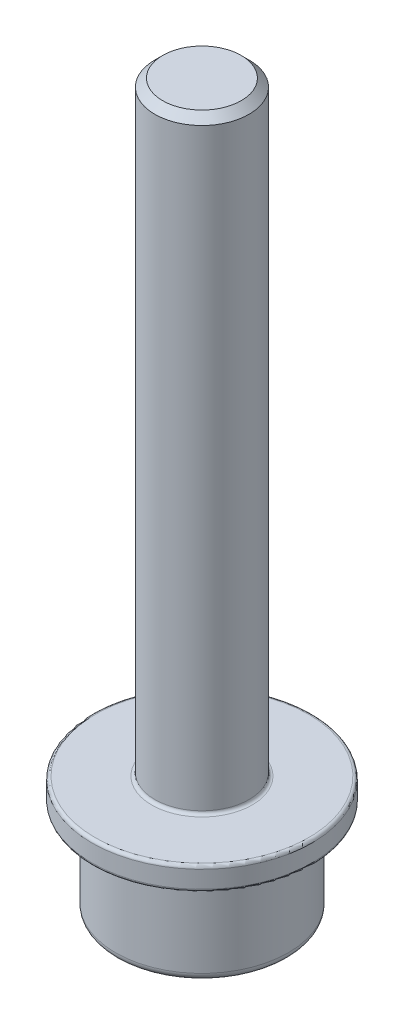
ISO-10303-21;
HEADER;
FILE_DESCRIPTION(('STEP AP214'),'2;1');
FILE_NAME('part.step','',(''),(''),'','','');
FILE_SCHEMA(('AUTOMOTIVE_DESIGN { 1 0 10303 214 1 1 1 1 }'));
ENDSEC;
DATA;
#1=APPLICATION_CONTEXT('core data for automotive mechanical design processes');
#2=APPLICATION_PROTOCOL_DEFINITION('international standard','automotive_design',2000,#1);
#3=PRODUCT_CONTEXT('',#1,'mechanical');
#4=PRODUCT('Part','Part','',(#3));
#5=PRODUCT_RELATED_PRODUCT_CATEGORY('part','',(#4));
#6=PRODUCT_DEFINITION_FORMATION('','',#4);
#7=PRODUCT_DEFINITION_CONTEXT('part definition',#1,'design');
#8=PRODUCT_DEFINITION('design','',#6,#7);
#9=PRODUCT_DEFINITION_SHAPE('','',#8);
#10=(LENGTH_UNIT() NAMED_UNIT(*) SI_UNIT(.MILLI.,.METRE.));
#11=(NAMED_UNIT(*) PLANE_ANGLE_UNIT() SI_UNIT($,.RADIAN.));
#12=(NAMED_UNIT(*) SI_UNIT($,.STERADIAN.) SOLID_ANGLE_UNIT());
#13=UNCERTAINTY_MEASURE_WITH_UNIT(LENGTH_MEASURE(1.E-05),#10,'distance_accuracy_value','');
#14=(GEOMETRIC_REPRESENTATION_CONTEXT(3) GLOBAL_UNCERTAINTY_ASSIGNED_CONTEXT((#13)) GLOBAL_UNIT_ASSIGNED_CONTEXT((#10,
#11,#12)) REPRESENTATION_CONTEXT('',''));
#15=CARTESIAN_POINT('',(0.,0.,0.));
#16=DIRECTION('',(0.,0.,1.));
#17=DIRECTION('',(1.,0.,0.));
#18=AXIS2_PLACEMENT_3D('',#15,#16,#17);
#19=CARTESIAN_POINT('',(0.,3.,0.));
#20=DIRECTION('',(0.,-1.,0.));
#21=DIRECTION('',(0.,0.,-1.));
#22=AXIS2_PLACEMENT_3D('',#19,#20,#21);
#23=CYLINDRICAL_SURFACE('',#22,2.75);
#24=CARTESIAN_POINT('',(0.,2.9,0.));
#25=DIRECTION('',(0.,1.,0.));
#26=DIRECTION('',(0.,0.,1.));
#27=AXIS2_PLACEMENT_3D('',#24,#25,#26);
#28=CIRCLE('',#27,2.75);
#29=CARTESIAN_POINT('',(0.,2.9,2.75));
#30=VERTEX_POINT('',#29);
#31=EDGE_CURVE('E201',#30,#30,#28,.F.);
#32=ORIENTED_EDGE('',*,*,#31,.T.);
#33=EDGE_LOOP('',(#32));
#34=FACE_BOUND('',#33,.T.);
#35=CARTESIAN_POINT('',(0.,0.25,0.));
#36=DIRECTION('',(0.,1.,0.));
#37=DIRECTION('',(0.,0.,1.));
#38=AXIS2_PLACEMENT_3D('',#35,#36,#37);
#39=CIRCLE('',#38,2.75);
#40=CARTESIAN_POINT('',(0.,0.25,2.75));
#41=VERTEX_POINT('',#40);
#42=EDGE_CURVE('E174',#41,#41,#39,.T.);
#43=ORIENTED_EDGE('',*,*,#42,.T.);
#44=EDGE_LOOP('',(#43));
#45=FACE_BOUND('',#44,.T.);
#46=ADVANCED_FACE('F33',(#34,#45),#23,.T.);
#47=CARTESIAN_POINT('',(0.,0.,0.));
#48=DIRECTION('',(0.,1.,0.));
#49=DIRECTION('',(0.,0.,1.));
#50=AXIS2_PLACEMENT_3D('',#47,#48,#49);
#51=PLANE('',#50);
#52=CARTESIAN_POINT('',(0.,0.,0.));
#53=DIRECTION('',(0.,1.,0.));
#54=DIRECTION('',(0.,0.,1.));
#55=AXIS2_PLACEMENT_3D('',#52,#53,#54);
#56=CIRCLE('',#55,2.5);
#57=CARTESIAN_POINT('',(0.,0.,2.5));
#58=VERTEX_POINT('',#57);
#59=EDGE_CURVE('E189',#58,#58,#56,.F.);
#60=ORIENTED_EDGE('',*,*,#59,.T.);
#61=EDGE_LOOP('',(#60));
#62=FACE_BOUND('',#61,.T.);
#63=DIRECTION('',(-0.69197693122312,0.,-0.721919612321922));
#64=VECTOR('',#63,1.);
#65=CARTESIAN_POINT('',(1.02450088015783,0.,-0.982008194523005));
#66=LINE('',#65,#64);
#67=CARTESIAN_POINT('',(1.5914635756121,0.,-0.390512335578875));
#68=VERTEX_POINT('',#67);
#69=CARTESIAN_POINT('',(0.457538184703552,0.,-1.57350405346713));
#70=VERTEX_POINT('',#69);
#71=EDGE_CURVE('E153',#68,#70,#66,.T.);
#72=ORIENTED_EDGE('',*,*,#71,.T.);
#73=DIRECTION('',(-0.971189189372558,0.,0.238309795111058));
#74=VECTOR('',#73,1.);
#75=CARTESIAN_POINT('',(-0.338193603102499,0.,-1.3782478856777));
#76=LINE('',#75,#74);
#77=CARTESIAN_POINT('',(-1.13392539090855,0.,-1.18299171788826));
#78=VERTEX_POINT('',#77);
#79=EDGE_CURVE('E163',#70,#78,#76,.T.);
#80=ORIENTED_EDGE('',*,*,#79,.T.);
#81=DIRECTION('',(-0.279212258149438,0.,0.96022940743298));
#82=VECTOR('',#81,1.);
#83=CARTESIAN_POINT('',(-1.36269448326033,0.,-0.396239691154692));
#84=LINE('',#83,#82);
#85=CARTESIAN_POINT('',(-1.5914635756121,0.,0.390512335578874));
#86=VERTEX_POINT('',#85);
#87=EDGE_CURVE('E161',#78,#86,#84,.T.);
#88=ORIENTED_EDGE('',*,*,#87,.T.);
#89=DIRECTION('',(0.69197693122312,0.,0.721919612321922));
#90=VECTOR('',#89,1.);
#91=CARTESIAN_POINT('',(-1.02450088015783,0.,0.982008194523004));
#92=LINE('',#91,#90);
#93=CARTESIAN_POINT('',(-0.457538184703551,0.,1.57350405346713));
#94=VERTEX_POINT('',#93);
#95=EDGE_CURVE('E159',#86,#94,#92,.T.);
#96=ORIENTED_EDGE('',*,*,#95,.T.);
#97=DIRECTION('',(0.971189189372558,0.,-0.238309795111058));
#98=VECTOR('',#97,1.);
#99=CARTESIAN_POINT('',(0.338193603102499,0.,1.3782478856777));
#100=LINE('',#99,#98);
#101=CARTESIAN_POINT('',(1.13392539090855,0.,1.18299171788826));
#102=VERTEX_POINT('',#101);
#103=EDGE_CURVE('E157',#94,#102,#100,.T.);
#104=ORIENTED_EDGE('',*,*,#103,.T.);
#105=DIRECTION('',(0.279212258149438,0.,-0.96022940743298));
#106=VECTOR('',#105,1.);
#107=CARTESIAN_POINT('',(1.36269448326033,0.,0.396239691154693));
#108=LINE('',#107,#106);
#109=EDGE_CURVE('E155',#102,#68,#108,.T.);
#110=ORIENTED_EDGE('',*,*,#109,.T.);
#111=EDGE_LOOP('',(#72,#80,#88,#96,#104,#110));
#112=FACE_BOUND('',#111,.T.);
#113=ADVANCED_FACE('F243',(#62,#112),#51,.F.);
#114=CARTESIAN_POINT('',(1.31110540565295,1.5,-0.321718223399928));
#115=DIRECTION('',(0.96022940743298,0.,0.279212258149438));
#116=DIRECTION('',(0.279212258149438,0.,-0.96022940743298));
#117=AXIS2_PLACEMENT_3D('',#114,#115,#116);
#118=PLANE('',#117);
#119=DIRECTION('',(0.,-1.,0.));
#120=VECTOR('',#119,1.);
#121=CARTESIAN_POINT('',(1.31110540565295,1.5,-0.321718223399928));
#122=LINE('',#121,#120);
#123=CARTESIAN_POINT('',(1.31110540565295,1.5,-0.321718223399928));
#124=VERTEX_POINT('',#123);
#125=CARTESIAN_POINT('',(1.31110540565295,0.25,-0.321718223399928));
#126=VERTEX_POINT('',#125);
#127=EDGE_CURVE('E139',#124,#126,#122,.T.);
#128=ORIENTED_EDGE('',*,*,#127,.T.);
#129=DIRECTION('',(-0.279212258149438,0.,0.96022940743298));
#130=VECTOR('',#129,1.);
#131=CARTESIAN_POINT('',(1.31110540565295,0.25,-0.321718223399928));
#132=LINE('',#131,#130);
#133=CARTESIAN_POINT('',(0.934168857151212,0.25,0.974591476634595));
#134=VERTEX_POINT('',#133);
#135=EDGE_CURVE('E55',#126,#134,#132,.T.);
#136=ORIENTED_EDGE('',*,*,#135,.T.);
#137=DIRECTION('',(0.,-1.,0.));
#138=VECTOR('',#137,1.);
#139=CARTESIAN_POINT('',(0.934168857151212,1.5,0.974591476634595));
#140=LINE('',#139,#138);
#141=CARTESIAN_POINT('',(0.934168857151212,1.5,0.974591476634595));
#142=VERTEX_POINT('',#141);
#143=EDGE_CURVE('E103',#142,#134,#140,.T.);
#144=ORIENTED_EDGE('',*,*,#143,.F.);
#145=DIRECTION('',(-0.279212258149438,0.,0.96022940743298));
#146=VECTOR('',#145,1.);
#147=CARTESIAN_POINT('',(1.31110540565295,1.5,-0.321718223399928));
#148=LINE('',#147,#146);
#149=EDGE_CURVE('E107',#124,#142,#148,.T.);
#150=ORIENTED_EDGE('',*,*,#149,.F.);
#151=EDGE_LOOP('',(#128,#136,#144,#150));
#152=FACE_BOUND('',#151,.T.);
#153=ADVANCED_FACE('F105',(#152),#118,.F.);
#154=CARTESIAN_POINT('',(0.376936548501741,1.5,-1.29630970003452));
#155=DIRECTION('',(0.721919612321922,0.,-0.69197693122312));
#156=DIRECTION('',(-0.69197693122312,0.,-0.721919612321922));
#157=AXIS2_PLACEMENT_3D('',#154,#155,#156);
#158=PLANE('',#157);
#159=DIRECTION('',(0.,-1.,0.));
#160=VECTOR('',#159,1.);
#161=CARTESIAN_POINT('',(0.376936548501741,1.5,-1.29630970003452));
#162=LINE('',#161,#160);
#163=CARTESIAN_POINT('',(0.376936548501741,1.5,-1.29630970003452));
#164=VERTEX_POINT('',#163);
#165=CARTESIAN_POINT('',(0.376936548501741,0.25,-1.29630970003452));
#166=VERTEX_POINT('',#165);
#167=EDGE_CURVE('E142',#164,#166,#162,.T.);
#168=ORIENTED_EDGE('',*,*,#167,.T.);
#169=DIRECTION('',(0.69197693122312,0.,0.721919612321922));
#170=VECTOR('',#169,1.);
#171=CARTESIAN_POINT('',(0.376936548501741,0.25,-1.29630970003452));
#172=LINE('',#171,#170);
#173=EDGE_CURVE('E48',#166,#126,#172,.T.);
#174=ORIENTED_EDGE('',*,*,#173,.T.);
#175=ORIENTED_EDGE('',*,*,#127,.F.);
#176=DIRECTION('',(0.69197693122312,0.,0.721919612321922));
#177=VECTOR('',#176,1.);
#178=CARTESIAN_POINT('',(0.376936548501741,1.5,-1.29630970003452));
#179=LINE('',#178,#177);
#180=EDGE_CURVE('E112',#164,#124,#179,.T.);
#181=ORIENTED_EDGE('',*,*,#180,.F.);
#182=EDGE_LOOP('',(#168,#174,#175,#181));
#183=FACE_BOUND('',#182,.T.);
#184=ADVANCED_FACE('F310',(#183),#158,.F.);
#185=CARTESIAN_POINT('',(-0.934168857151211,1.5,-0.974591476634595));
#186=DIRECTION('',(-0.238309795111058,0.,-0.971189189372557));
#187=DIRECTION('',(-0.971189189372558,0.,0.238309795111058));
#188=AXIS2_PLACEMENT_3D('',#185,#186,#187);
#189=PLANE('',#188);
#190=DIRECTION('',(0.,-1.,0.));
#191=VECTOR('',#190,1.);
#192=CARTESIAN_POINT('',(-0.934168857151211,1.5,-0.974591476634595));
#193=LINE('',#192,#191);
#194=CARTESIAN_POINT('',(-0.934168857151211,1.5,-0.974591476634595));
#195=VERTEX_POINT('',#194);
#196=CARTESIAN_POINT('',(-0.934168857151211,0.25,-0.974591476634595));
#197=VERTEX_POINT('',#196);
#198=EDGE_CURVE('E144',#195,#197,#193,.T.);
#199=ORIENTED_EDGE('',*,*,#198,.T.);
#200=DIRECTION('',(0.971189189372558,0.,-0.238309795111058));
#201=VECTOR('',#200,1.);
#202=CARTESIAN_POINT('',(-0.934168857151211,0.25,-0.974591476634595));
#203=LINE('',#202,#201);
#204=EDGE_CURVE('E141',#197,#166,#203,.T.);
#205=ORIENTED_EDGE('',*,*,#204,.T.);
#206=ORIENTED_EDGE('',*,*,#167,.F.);
#207=DIRECTION('',(0.971189189372558,0.,-0.238309795111058));
#208=VECTOR('',#207,1.);
#209=CARTESIAN_POINT('',(-0.934168857151211,1.5,-0.974591476634595));
#210=LINE('',#209,#208);
#211=EDGE_CURVE('E136',#195,#164,#210,.T.);
#212=ORIENTED_EDGE('',*,*,#211,.F.);
#213=EDGE_LOOP('',(#199,#205,#206,#212));
#214=FACE_BOUND('',#213,.T.);
#215=ADVANCED_FACE('F320',(#214),#189,.F.);
#216=CARTESIAN_POINT('',(-1.31110540565295,1.5,0.321718223399928));
#217=DIRECTION('',(-0.96022940743298,0.,-0.279212258149438));
#218=DIRECTION('',(-0.279212258149438,0.,0.96022940743298));
#219=AXIS2_PLACEMENT_3D('',#216,#217,#218);
#220=PLANE('',#219);
#221=DIRECTION('',(0.,-1.,0.));
#222=VECTOR('',#221,1.);
#223=CARTESIAN_POINT('',(-1.31110540565295,1.5,0.321718223399928));
#224=LINE('',#223,#222);
#225=CARTESIAN_POINT('',(-1.31110540565295,1.5,0.321718223399928));
#226=VERTEX_POINT('',#225);
#227=CARTESIAN_POINT('',(-1.31110540565295,0.25,0.321718223399928));
#228=VERTEX_POINT('',#227);
#229=EDGE_CURVE('E147',#226,#228,#224,.T.);
#230=ORIENTED_EDGE('',*,*,#229,.T.);
#231=DIRECTION('',(0.279212258149438,0.,-0.96022940743298));
#232=VECTOR('',#231,1.);
#233=CARTESIAN_POINT('',(-1.31110540565295,0.25,0.321718223399928));
#234=LINE('',#233,#232);
#235=EDGE_CURVE('E166',#228,#197,#234,.T.);
#236=ORIENTED_EDGE('',*,*,#235,.T.);
#237=ORIENTED_EDGE('',*,*,#198,.F.);
#238=DIRECTION('',(0.279212258149438,0.,-0.96022940743298));
#239=VECTOR('',#238,1.);
#240=CARTESIAN_POINT('',(-1.31110540565295,1.5,0.321718223399928));
#241=LINE('',#240,#239);
#242=EDGE_CURVE('E133',#226,#195,#241,.T.);
#243=ORIENTED_EDGE('',*,*,#242,.F.);
#244=EDGE_LOOP('',(#230,#236,#237,#243));
#245=FACE_BOUND('',#244,.T.);
#246=ADVANCED_FACE('F316',(#245),#220,.F.);
#247=CARTESIAN_POINT('',(-0.376936548501741,1.5,1.29630970003452));
#248=DIRECTION('',(-0.721919612321922,0.,0.69197693122312));
#249=DIRECTION('',(0.69197693122312,0.,0.721919612321922));
#250=AXIS2_PLACEMENT_3D('',#247,#248,#249);
#251=PLANE('',#250);
#252=DIRECTION('',(0.,-1.,0.));
#253=VECTOR('',#252,1.);
#254=CARTESIAN_POINT('',(-0.376936548501741,1.5,1.29630970003452));
#255=LINE('',#254,#253);
#256=CARTESIAN_POINT('',(-0.376936548501741,1.5,1.29630970003452));
#257=VERTEX_POINT('',#256);
#258=CARTESIAN_POINT('',(-0.376936548501741,0.25,1.29630970003452));
#259=VERTEX_POINT('',#258);
#260=EDGE_CURVE('E111',#257,#259,#255,.T.);
#261=ORIENTED_EDGE('',*,*,#260,.T.);
#262=DIRECTION('',(-0.69197693122312,0.,-0.721919612321922));
#263=VECTOR('',#262,1.);
#264=CARTESIAN_POINT('',(-0.376936548501741,0.25,1.29630970003452));
#265=LINE('',#264,#263);
#266=EDGE_CURVE('E168',#259,#228,#265,.T.);
#267=ORIENTED_EDGE('',*,*,#266,.T.);
#268=ORIENTED_EDGE('',*,*,#229,.F.);
#269=DIRECTION('',(-0.69197693122312,0.,-0.721919612321922));
#270=VECTOR('',#269,1.);
#271=CARTESIAN_POINT('',(-0.376936548501741,1.5,1.29630970003452));
#272=LINE('',#271,#270);
#273=EDGE_CURVE('E121',#257,#226,#272,.T.);
#274=ORIENTED_EDGE('',*,*,#273,.F.);
#275=EDGE_LOOP('',(#261,#267,#268,#274));
#276=FACE_BOUND('',#275,.T.);
#277=ADVANCED_FACE('F313',(#276),#251,.F.);
#278=CARTESIAN_POINT('',(0.934168857151212,1.5,0.974591476634595));
#279=DIRECTION('',(0.238309795111058,0.,0.971189189372558));
#280=DIRECTION('',(0.971189189372558,0.,-0.238309795111058));
#281=AXIS2_PLACEMENT_3D('',#278,#279,#280);
#282=PLANE('',#281);
#283=ORIENTED_EDGE('',*,*,#143,.T.);
#284=DIRECTION('',(-0.971189189372558,0.,0.238309795111058));
#285=VECTOR('',#284,1.);
#286=CARTESIAN_POINT('',(0.934168857151212,0.25,0.974591476634595));
#287=LINE('',#286,#285);
#288=EDGE_CURVE('E170',#134,#259,#287,.T.);
#289=ORIENTED_EDGE('',*,*,#288,.T.);
#290=ORIENTED_EDGE('',*,*,#260,.F.);
#291=DIRECTION('',(-0.971189189372557,0.,0.238309795111058));
#292=VECTOR('',#291,1.);
#293=CARTESIAN_POINT('',(0.934168857151212,1.5,0.974591476634595));
#294=LINE('',#293,#292);
#295=EDGE_CURVE('E115',#142,#257,#294,.T.);
#296=ORIENTED_EDGE('',*,*,#295,.F.);
#297=EDGE_LOOP('',(#283,#289,#290,#296));
#298=FACE_BOUND('',#297,.T.);
#299=ADVANCED_FACE('F116',(#298),#282,.F.);
#300=CARTESIAN_POINT('',(0.,1.5,0.));
#301=DIRECTION('',(0.,-1.,0.));
#302=DIRECTION('',(0.,0.,-1.));
#303=AXIS2_PLACEMENT_3D('',#300,#301,#302);
#304=PLANE('',#303);
#305=ORIENTED_EDGE('',*,*,#149,.T.);
#306=ORIENTED_EDGE('',*,*,#295,.T.);
#307=ORIENTED_EDGE('',*,*,#273,.T.);
#308=ORIENTED_EDGE('',*,*,#242,.T.);
#309=ORIENTED_EDGE('',*,*,#211,.T.);
#310=ORIENTED_EDGE('',*,*,#180,.T.);
#311=EDGE_LOOP('',(#305,#306,#307,#308,#309,#310));
#312=FACE_BOUND('',#311,.T.);
#313=ADVANCED_FACE('F123',(#312),#304,.T.);
#314=CARTESIAN_POINT('',(0.934168857151212,0.25,0.974591476634595));
#315=DIRECTION('',(0.168510472146207,0.707106781186545,0.686734461620404));
#316=DIRECTION('',(-0.971189189372558,0.,0.238309795111058));
#317=AXIS2_PLACEMENT_3D('',#314,#315,#316);
#318=PLANE('',#317);
#319=DIRECTION('',(-0.523085392288577,0.65465367070798,-0.545719931652559));
#320=VECTOR('',#319,1.);
#321=CARTESIAN_POINT('',(0.934168857151212,0.25,0.974591476634595));
#322=LINE('',#321,#320);
#323=EDGE_CURVE('E129',#102,#134,#322,.T.);
#324=ORIENTED_EDGE('',*,*,#323,.F.);
#325=ORIENTED_EDGE('',*,*,#103,.F.);
#326=DIRECTION('',(0.211064628018337,0.65465367070798,-0.725865203896735));
#327=VECTOR('',#326,1.);
#328=CARTESIAN_POINT('',(-0.376936548501741,0.25,1.29630970003452));
#329=LINE('',#328,#327);
#330=EDGE_CURVE('E126',#259,#94,#329,.F.);
#331=ORIENTED_EDGE('',*,*,#330,.F.);
#332=ORIENTED_EDGE('',*,*,#288,.F.);
#333=EDGE_LOOP('',(#324,#325,#331,#332));
#334=FACE_BOUND('',#333,.T.);
#335=ADVANCED_FACE('F273',(#334),#318,.F.);
#336=CARTESIAN_POINT('',(-0.376936548501741,0.25,1.29630970003452));
#337=DIRECTION('',(-0.510474253344396,0.707106781186545,0.489301580492527));
#338=DIRECTION('',(-0.69197693122312,0.,-0.721919612321922));
#339=AXIS2_PLACEMENT_3D('',#336,#337,#338);
#340=PLANE('',#339);
#341=ORIENTED_EDGE('',*,*,#330,.T.);
#342=ORIENTED_EDGE('',*,*,#95,.F.);
#343=DIRECTION('',(0.734150020306913,0.65465367070798,-0.180145272244175));
#344=VECTOR('',#343,1.);
#345=CARTESIAN_POINT('',(-1.31110540565295,0.25,0.321718223399928));
#346=LINE('',#345,#344);
#347=EDGE_CURVE('E182',#228,#86,#346,.F.);
#348=ORIENTED_EDGE('',*,*,#347,.F.);
#349=ORIENTED_EDGE('',*,*,#266,.F.);
#350=EDGE_LOOP('',(#341,#342,#348,#349));
#351=FACE_BOUND('',#350,.T.);
#352=ADVANCED_FACE('F269',(#351),#340,.F.);
#353=CARTESIAN_POINT('',(1.31110540565295,0.25,-0.321718223399928));
#354=DIRECTION('',(0.678984725490602,0.707106781186545,0.197432881127877));
#355=DIRECTION('',(-0.279212258149438,0.,0.96022940743298));
#356=AXIS2_PLACEMENT_3D('',#353,#354,#355);
#357=PLANE('',#356);
#358=ORIENTED_EDGE('',*,*,#323,.T.);
#359=ORIENTED_EDGE('',*,*,#135,.F.);
#360=DIRECTION('',(-0.734150020306913,0.65465367070798,0.180145272244175));
#361=VECTOR('',#360,1.);
#362=CARTESIAN_POINT('',(1.31110540565295,0.25,-0.321718223399928));
#363=LINE('',#362,#361);
#364=EDGE_CURVE('E179',#68,#126,#363,.T.);
#365=ORIENTED_EDGE('',*,*,#364,.F.);
#366=ORIENTED_EDGE('',*,*,#109,.F.);
#367=EDGE_LOOP('',(#358,#359,#365,#366));
#368=FACE_BOUND('',#367,.T.);
#369=ADVANCED_FACE('F265',(#368),#357,.F.);
#370=CARTESIAN_POINT('',(-1.31110540565295,0.25,0.321718223399928));
#371=DIRECTION('',(-0.678984725490602,0.707106781186545,-0.197432881127877));
#372=DIRECTION('',(0.279212258149438,0.,-0.96022940743298));
#373=AXIS2_PLACEMENT_3D('',#370,#371,#372);
#374=PLANE('',#373);
#375=ORIENTED_EDGE('',*,*,#347,.T.);
#376=ORIENTED_EDGE('',*,*,#87,.F.);
#377=DIRECTION('',(0.523085392288576,0.65465367070798,0.54571993165256));
#378=VECTOR('',#377,1.);
#379=CARTESIAN_POINT('',(-0.934168857151211,0.25,-0.974591476634595));
#380=LINE('',#379,#378);
#381=EDGE_CURVE('E177',#197,#78,#380,.F.);
#382=ORIENTED_EDGE('',*,*,#381,.F.);
#383=ORIENTED_EDGE('',*,*,#235,.F.);
#384=EDGE_LOOP('',(#375,#376,#382,#383));
#385=FACE_BOUND('',#384,.T.);
#386=ADVANCED_FACE('F261',(#385),#374,.F.);
#387=CARTESIAN_POINT('',(0.376936548501741,0.25,-1.29630970003452));
#388=DIRECTION('',(0.510474253344396,0.707106781186545,-0.489301580492527));
#389=DIRECTION('',(0.69197693122312,0.,0.721919612321922));
#390=AXIS2_PLACEMENT_3D('',#387,#388,#389);
#391=PLANE('',#390);
#392=ORIENTED_EDGE('',*,*,#364,.T.);
#393=ORIENTED_EDGE('',*,*,#173,.F.);
#394=DIRECTION('',(0.211064628018337,-0.65465367070798,-0.725865203896735));
#395=VECTOR('',#394,1.);
#396=CARTESIAN_POINT('',(0.269240391786958,0.584038370031141,-0.925935500024662));
#397=LINE('',#396,#395);
#398=EDGE_CURVE('E175',#70,#166,#397,.F.);
#399=ORIENTED_EDGE('',*,*,#398,.F.);
#400=ORIENTED_EDGE('',*,*,#71,.F.);
#401=EDGE_LOOP('',(#392,#393,#399,#400));
#402=FACE_BOUND('',#401,.T.);
#403=ADVANCED_FACE('F257',(#402),#391,.F.);
#404=CARTESIAN_POINT('',(-0.934168857151211,0.25,-0.974591476634595));
#405=DIRECTION('',(-0.168510472146206,0.707106781186545,-0.686734461620404));
#406=DIRECTION('',(0.971189189372558,0.,-0.238309795111058));
#407=AXIS2_PLACEMENT_3D('',#404,#405,#406);
#408=PLANE('',#407);
#409=ORIENTED_EDGE('',*,*,#381,.T.);
#410=ORIENTED_EDGE('',*,*,#79,.F.);
#411=ORIENTED_EDGE('',*,*,#398,.T.);
#412=ORIENTED_EDGE('',*,*,#204,.F.);
#413=EDGE_LOOP('',(#409,#410,#411,#412));
#414=FACE_BOUND('',#413,.T.);
#415=ADVANCED_FACE('F254',(#414),#408,.F.);
#416=CARTESIAN_POINT('',(0.,0.25,0.));
#417=DIRECTION('',(0.,1.,0.));
#418=DIRECTION('',(0.,0.,1.));
#419=AXIS2_PLACEMENT_3D('',#416,#417,#418);
#420=TOROIDAL_SURFACE('',#419,2.5,0.25);
#421=ORIENTED_EDGE('',*,*,#59,.F.);
#422=EDGE_LOOP('',(#421));
#423=FACE_BOUND('',#422,.T.);
#424=ORIENTED_EDGE('',*,*,#42,.F.);
#425=EDGE_LOOP('',(#424));
#426=FACE_BOUND('',#425,.T.);
#427=ADVANCED_FACE('F239',(#423,#426),#420,.T.);
#428=CARTESIAN_POINT('',(0.,2.9,0.));
#429=DIRECTION('',(0.,1.,0.));
#430=DIRECTION('',(0.,0.,1.));
#431=AXIS2_PLACEMENT_3D('',#428,#429,#430);
#432=TOROIDAL_SURFACE('',#431,2.65,0.1);
#433=ORIENTED_EDGE('',*,*,#31,.F.);
#434=EDGE_LOOP('',(#433));
#435=FACE_BOUND('',#434,.T.);
#436=CARTESIAN_POINT('',(0.,3.,0.));
#437=DIRECTION('',(0.,1.,0.));
#438=DIRECTION('',(0.,0.,1.));
#439=AXIS2_PLACEMENT_3D('',#436,#437,#438);
#440=CIRCLE('',#439,2.65);
#441=CARTESIAN_POINT('',(0.,3.,2.65));
#442=VERTEX_POINT('',#441);
#443=EDGE_CURVE('E198',#442,#442,#440,.T.);
#444=ORIENTED_EDGE('',*,*,#443,.F.);
#445=EDGE_LOOP('',(#444));
#446=FACE_BOUND('',#445,.T.);
#447=ADVANCED_FACE('F230',(#435,#446),#432,.T.);
#448=CARTESIAN_POINT('',(0.,3.75,0.));
#449=DIRECTION('',(0.,1.,0.));
#450=DIRECTION('',(0.,0.,1.));
#451=AXIS2_PLACEMENT_3D('',#448,#449,#450);
#452=PLANE('',#451);
#453=CARTESIAN_POINT('',(0.,3.75,0.));
#454=DIRECTION('',(0.,1.,0.));
#455=DIRECTION('',(0.,0.,1.));
#456=AXIS2_PLACEMENT_3D('',#453,#454,#455);
#457=CIRCLE('',#456,1.6);
#458=CARTESIAN_POINT('',(0.,3.75,1.6));
#459=VERTEX_POINT('',#458);
#460=EDGE_CURVE('E210',#459,#459,#457,.F.);
#461=ORIENTED_EDGE('',*,*,#460,.T.);
#462=EDGE_LOOP('',(#461));
#463=FACE_BOUND('',#462,.T.);
#464=CARTESIAN_POINT('',(0.,3.75,0.));
#465=DIRECTION('',(0.,1.,0.));
#466=DIRECTION('',(0.,0.,1.));
#467=AXIS2_PLACEMENT_3D('',#464,#465,#466);
#468=CIRCLE('',#467,3.4);
#469=CARTESIAN_POINT('',(0.,3.75,3.4));
#470=VERTEX_POINT('',#469);
#471=EDGE_CURVE('E207',#470,#470,#468,.T.);
#472=ORIENTED_EDGE('',*,*,#471,.T.);
#473=EDGE_LOOP('',(#472));
#474=FACE_BOUND('',#473,.T.);
#475=ADVANCED_FACE('F227',(#463,#474),#452,.T.);
#476=CARTESIAN_POINT('',(0.,3.,0.));
#477=DIRECTION('',(0.,1.,0.));
#478=DIRECTION('',(0.,0.,1.));
#479=AXIS2_PLACEMENT_3D('',#476,#477,#478);
#480=PLANE('',#479);
#481=CARTESIAN_POINT('',(0.,3.,0.));
#482=DIRECTION('',(0.,1.,0.));
#483=DIRECTION('',(0.,0.,1.));
#484=AXIS2_PLACEMENT_3D('',#481,#482,#483);
#485=CIRCLE('',#484,3.4);
#486=CARTESIAN_POINT('',(0.,3.,3.4));
#487=VERTEX_POINT('',#486);
#488=EDGE_CURVE('E11',#487,#487,#485,.F.);
#489=ORIENTED_EDGE('',*,*,#488,.T.);
#490=EDGE_LOOP('',(#489));
#491=FACE_BOUND('',#490,.T.);
#492=ORIENTED_EDGE('',*,*,#443,.T.);
#493=EDGE_LOOP('',(#492));
#494=FACE_BOUND('',#493,.T.);
#495=ADVANCED_FACE('F229',(#491,#494),#480,.F.);
#496=CARTESIAN_POINT('',(0.,3.75,0.));
#497=DIRECTION('',(0.,-1.,0.));
#498=DIRECTION('',(0.,0.,-1.));
#499=AXIS2_PLACEMENT_3D('',#496,#497,#498);
#500=CYLINDRICAL_SURFACE('',#499,3.5);
#501=CARTESIAN_POINT('',(0.,3.65,0.));
#502=DIRECTION('',(0.,1.,0.));
#503=DIRECTION('',(0.,0.,1.));
#504=AXIS2_PLACEMENT_3D('',#501,#502,#503);
#505=CIRCLE('',#504,3.5);
#506=CARTESIAN_POINT('',(0.,3.65,3.5));
#507=VERTEX_POINT('',#506);
#508=EDGE_CURVE('E41',#507,#507,#505,.F.);
#509=ORIENTED_EDGE('',*,*,#508,.T.);
#510=EDGE_LOOP('',(#509));
#511=FACE_BOUND('',#510,.T.);
#512=CARTESIAN_POINT('',(0.,3.1,0.));
#513=DIRECTION('',(0.,1.,0.));
#514=DIRECTION('',(0.,0.,1.));
#515=AXIS2_PLACEMENT_3D('',#512,#513,#514);
#516=CIRCLE('',#515,3.5);
#517=CARTESIAN_POINT('',(0.,3.1,3.5));
#518=VERTEX_POINT('',#517);
#519=EDGE_CURVE('E213',#518,#518,#516,.T.);
#520=ORIENTED_EDGE('',*,*,#519,.T.);
#521=EDGE_LOOP('',(#520));
#522=FACE_BOUND('',#521,.T.);
#523=ADVANCED_FACE('F218',(#511,#522),#500,.T.);
#524=CARTESIAN_POINT('',(0.,23.,0.));
#525=DIRECTION('',(0.,1.,0.));
#526=DIRECTION('',(0.,0.,1.));
#527=AXIS2_PLACEMENT_3D('',#524,#525,#526);
#528=PLANE('',#527);
#529=CARTESIAN_POINT('',(0.,23.,0.));
#530=DIRECTION('',(0.,1.,0.));
#531=DIRECTION('',(0.,0.,1.));
#532=AXIS2_PLACEMENT_3D('',#529,#530,#531);
#533=CIRCLE('',#532,1.24999999999999);
#534=CARTESIAN_POINT('',(0.,23.,1.24999999999999));
#535=VERTEX_POINT('',#534);
#536=EDGE_CURVE('E192',#535,#535,#533,.T.);
#537=ORIENTED_EDGE('',*,*,#536,.T.);
#538=EDGE_LOOP('',(#537));
#539=FACE_BOUND('',#538,.T.);
#540=ADVANCED_FACE('F284',(#539),#528,.T.);
#541=CARTESIAN_POINT('',(0.,23.,0.));
#542=DIRECTION('',(0.,-1.,0.));
#543=DIRECTION('',(0.,0.,-1.));
#544=AXIS2_PLACEMENT_3D('',#541,#542,#543);
#545=CONICAL_SURFACE('',#544,1.24999999999999,0.785398163397453);
#546=CARTESIAN_POINT('',(0.,22.75,0.));
#547=DIRECTION('',(0.,1.,0.));
#548=DIRECTION('',(0.,0.,1.));
#549=AXIS2_PLACEMENT_3D('',#546,#547,#548);
#550=CIRCLE('',#549,1.5);
#551=CARTESIAN_POINT('',(0.,22.75,1.5));
#552=VERTEX_POINT('',#551);
#553=EDGE_CURVE('E195',#552,#552,#550,.F.);
#554=ORIENTED_EDGE('',*,*,#553,.F.);
#555=EDGE_LOOP('',(#554));
#556=FACE_BOUND('',#555,.T.);
#557=ORIENTED_EDGE('',*,*,#536,.F.);
#558=EDGE_LOOP('',(#557));
#559=FACE_BOUND('',#558,.T.);
#560=ADVANCED_FACE('F281',(#556,#559),#545,.T.);
#561=CARTESIAN_POINT('',(0.,23.,0.));
#562=DIRECTION('',(0.,-1.,0.));
#563=DIRECTION('',(0.,0.,-1.));
#564=AXIS2_PLACEMENT_3D('',#561,#562,#563);
#565=CYLINDRICAL_SURFACE('',#564,1.5);
#566=CARTESIAN_POINT('',(0.,3.85,0.));
#567=DIRECTION('',(0.,1.,0.));
#568=DIRECTION('',(0.,0.,1.));
#569=AXIS2_PLACEMENT_3D('',#566,#567,#568);
#570=CIRCLE('',#569,1.5);
#571=CARTESIAN_POINT('',(0.,3.85,1.5));
#572=VERTEX_POINT('',#571);
#573=EDGE_CURVE('E204',#572,#572,#570,.T.);
#574=ORIENTED_EDGE('',*,*,#573,.T.);
#575=EDGE_LOOP('',(#574));
#576=FACE_BOUND('',#575,.T.);
#577=ORIENTED_EDGE('',*,*,#553,.T.);
#578=EDGE_LOOP('',(#577));
#579=FACE_BOUND('',#578,.T.);
#580=ADVANCED_FACE('F283',(#576,#579),#565,.T.);
#581=CARTESIAN_POINT('',(0.,3.85,0.));
#582=DIRECTION('',(0.,1.,0.));
#583=DIRECTION('',(0.,0.,1.));
#584=AXIS2_PLACEMENT_3D('',#581,#582,#583);
#585=TOROIDAL_SURFACE('',#584,1.6,0.1);
#586=ORIENTED_EDGE('',*,*,#460,.F.);
#587=EDGE_LOOP('',(#586));
#588=FACE_BOUND('',#587,.T.);
#589=ORIENTED_EDGE('',*,*,#573,.F.);
#590=EDGE_LOOP('',(#589));
#591=FACE_BOUND('',#590,.T.);
#592=ADVANCED_FACE('F224',(#588,#591),#585,.F.);
#593=CARTESIAN_POINT('',(0.,3.65,0.));
#594=DIRECTION('',(0.,1.,0.));
#595=DIRECTION('',(0.,0.,1.));
#596=AXIS2_PLACEMENT_3D('',#593,#594,#595);
#597=TOROIDAL_SURFACE('',#596,3.4,0.1);
#598=ORIENTED_EDGE('',*,*,#508,.F.);
#599=EDGE_LOOP('',(#598));
#600=FACE_BOUND('',#599,.T.);
#601=ORIENTED_EDGE('',*,*,#471,.F.);
#602=EDGE_LOOP('',(#601));
#603=FACE_BOUND('',#602,.T.);
#604=ADVANCED_FACE('F221',(#600,#603),#597,.T.);
#605=CARTESIAN_POINT('',(0.,3.1,0.));
#606=DIRECTION('',(0.,1.,0.));
#607=DIRECTION('',(0.,0.,1.));
#608=AXIS2_PLACEMENT_3D('',#605,#606,#607);
#609=TOROIDAL_SURFACE('',#608,3.4,0.1);
#610=ORIENTED_EDGE('',*,*,#488,.F.);
#611=EDGE_LOOP('',(#610));
#612=FACE_BOUND('',#611,.T.);
#613=ORIENTED_EDGE('',*,*,#519,.F.);
#614=EDGE_LOOP('',(#613));
#615=FACE_BOUND('',#614,.T.);
#616=ADVANCED_FACE('F35',(#612,#615),#609,.T.);
#617=CLOSED_SHELL('',(#46,#113,#153,#184,#215,#246,#277,#299,#313,#335,#352,#369,#386,#403,#415,
#427,#447,#475,#495,#523,#540,#560,#580,#592,#604,#616));
#618=MANIFOLD_SOLID_BREP('B2',#617);
#619=ADVANCED_BREP_SHAPE_REPRESENTATION('',(#18,#618),#14);
#620=SHAPE_DEFINITION_REPRESENTATION(#9,#619);
ENDSEC;
END-ISO-10303-21;
